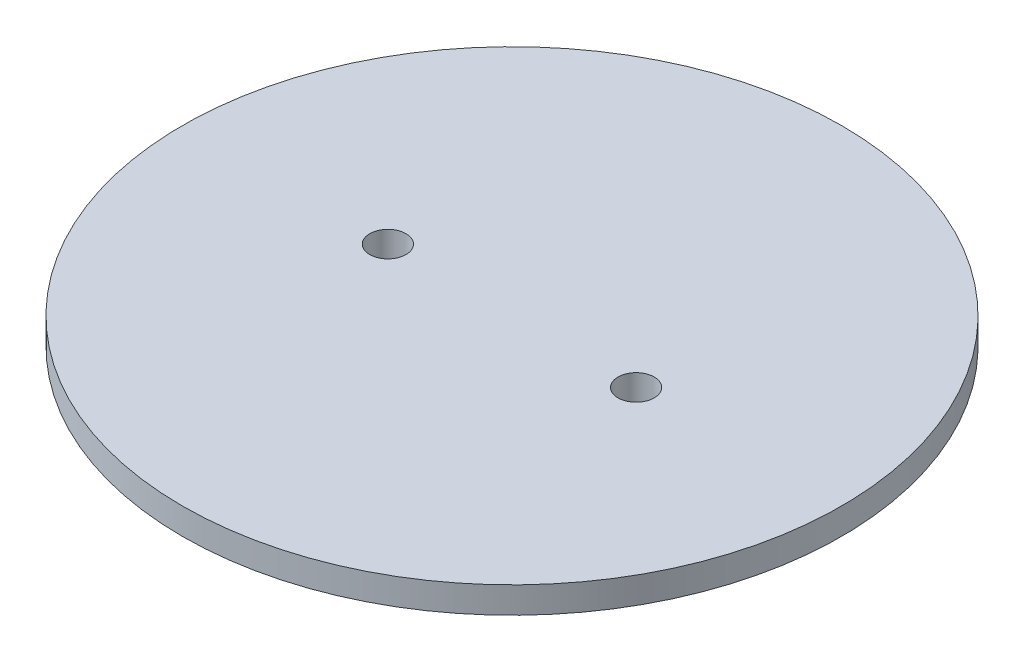
ISO-10303-21;
HEADER;
FILE_DESCRIPTION(('STEP AP214'),'2;1');
FILE_NAME('part.step','',(''),(''),'','','');
FILE_SCHEMA(('AUTOMOTIVE_DESIGN { 1 0 10303 214 1 1 1 1 }'));
ENDSEC;
DATA;
#1=APPLICATION_CONTEXT('core data for automotive mechanical design processes');
#2=APPLICATION_PROTOCOL_DEFINITION('international standard','automotive_design',2000,#1);
#3=PRODUCT_CONTEXT('',#1,'mechanical');
#4=PRODUCT('Part','Part','',(#3));
#5=PRODUCT_RELATED_PRODUCT_CATEGORY('part','',(#4));
#6=PRODUCT_DEFINITION_FORMATION('','',#4);
#7=PRODUCT_DEFINITION_CONTEXT('part definition',#1,'design');
#8=PRODUCT_DEFINITION('design','',#6,#7);
#9=PRODUCT_DEFINITION_SHAPE('','',#8);
#10=(LENGTH_UNIT() NAMED_UNIT(*) SI_UNIT(.MILLI.,.METRE.));
#11=(NAMED_UNIT(*) PLANE_ANGLE_UNIT() SI_UNIT($,.RADIAN.));
#12=(NAMED_UNIT(*) SI_UNIT($,.STERADIAN.) SOLID_ANGLE_UNIT());
#13=UNCERTAINTY_MEASURE_WITH_UNIT(LENGTH_MEASURE(1.E-05),#10,'distance_accuracy_value','');
#14=(GEOMETRIC_REPRESENTATION_CONTEXT(3) GLOBAL_UNCERTAINTY_ASSIGNED_CONTEXT((#13)) GLOBAL_UNIT_ASSIGNED_CONTEXT((#10,
#11,#12)) REPRESENTATION_CONTEXT('',''));
#15=CARTESIAN_POINT('',(0.,0.,0.));
#16=DIRECTION('',(0.,0.,1.));
#17=DIRECTION('',(1.,0.,0.));
#18=AXIS2_PLACEMENT_3D('',#15,#16,#17);
#19=CARTESIAN_POINT('',(-18.83,4.,0.));
#20=DIRECTION('',(0.,-1.,0.));
#21=DIRECTION('',(0.,0.,-1.));
#22=AXIS2_PLACEMENT_3D('',#19,#20,#21);
#23=CYLINDRICAL_SURFACE('',#22,2.75);
#24=CARTESIAN_POINT('',(-18.83,4.,0.));
#25=DIRECTION('',(0.,1.,0.));
#26=DIRECTION('',(0.,0.,1.));
#27=AXIS2_PLACEMENT_3D('',#24,#25,#26);
#28=CIRCLE('',#27,2.75);
#29=CARTESIAN_POINT('',(-18.83,4.,2.75));
#30=VERTEX_POINT('',#29);
#31=EDGE_CURVE('E41',#30,#30,#28,.T.);
#32=ORIENTED_EDGE('',*,*,#31,.T.);
#33=EDGE_LOOP('',(#32));
#34=FACE_BOUND('',#33,.T.);
#35=CARTESIAN_POINT('',(-18.83,0.,0.));
#36=DIRECTION('',(0.,1.,0.));
#37=DIRECTION('',(0.,0.,1.));
#38=AXIS2_PLACEMENT_3D('',#35,#36,#37);
#39=CIRCLE('',#38,2.75);
#40=CARTESIAN_POINT('',(-18.83,0.,2.75));
#41=VERTEX_POINT('',#40);
#42=EDGE_CURVE('E52',#41,#41,#39,.T.);
#43=ORIENTED_EDGE('',*,*,#42,.F.);
#44=EDGE_LOOP('',(#43));
#45=FACE_BOUND('',#44,.T.);
#46=ADVANCED_FACE('F33',(#34,#45),#23,.F.);
#47=CARTESIAN_POINT('',(18.83,4.,0.));
#48=DIRECTION('',(0.,-1.,0.));
#49=DIRECTION('',(0.,0.,-1.));
#50=AXIS2_PLACEMENT_3D('',#47,#48,#49);
#51=CYLINDRICAL_SURFACE('',#50,2.75);
#52=CARTESIAN_POINT('',(18.83,4.,0.));
#53=DIRECTION('',(0.,1.,0.));
#54=DIRECTION('',(0.,0.,1.));
#55=AXIS2_PLACEMENT_3D('',#52,#53,#54);
#56=CIRCLE('',#55,2.75);
#57=CARTESIAN_POINT('',(18.83,4.,2.75));
#58=VERTEX_POINT('',#57);
#59=EDGE_CURVE('E46',#58,#58,#56,.T.);
#60=ORIENTED_EDGE('',*,*,#59,.T.);
#61=EDGE_LOOP('',(#60));
#62=FACE_BOUND('',#61,.T.);
#63=CARTESIAN_POINT('',(18.83,0.,0.));
#64=DIRECTION('',(0.,1.,0.));
#65=DIRECTION('',(0.,0.,1.));
#66=AXIS2_PLACEMENT_3D('',#63,#64,#65);
#67=CIRCLE('',#66,2.75);
#68=CARTESIAN_POINT('',(18.83,0.,2.75));
#69=VERTEX_POINT('',#68);
#70=EDGE_CURVE('E50',#69,#69,#67,.T.);
#71=ORIENTED_EDGE('',*,*,#70,.F.);
#72=EDGE_LOOP('',(#71));
#73=FACE_BOUND('',#72,.T.);
#74=ADVANCED_FACE('F35',(#62,#73),#51,.F.);
#75=CARTESIAN_POINT('',(0.,4.,0.));
#76=DIRECTION('',(0.,-1.,0.));
#77=DIRECTION('',(0.,0.,-1.));
#78=AXIS2_PLACEMENT_3D('',#75,#76,#77);
#79=CYLINDRICAL_SURFACE('',#78,50.);
#80=CARTESIAN_POINT('',(0.,4.,0.));
#81=DIRECTION('',(0.,1.,0.));
#82=DIRECTION('',(0.,0.,1.));
#83=AXIS2_PLACEMENT_3D('',#80,#81,#82);
#84=CIRCLE('',#83,50.);
#85=CARTESIAN_POINT('',(0.,4.,50.));
#86=VERTEX_POINT('',#85);
#87=EDGE_CURVE('E10',#86,#86,#84,.T.);
#88=ORIENTED_EDGE('',*,*,#87,.F.);
#89=EDGE_LOOP('',(#88));
#90=FACE_BOUND('',#89,.T.);
#91=CARTESIAN_POINT('',(0.,0.,0.));
#92=DIRECTION('',(0.,1.,0.));
#93=DIRECTION('',(0.,0.,1.));
#94=AXIS2_PLACEMENT_3D('',#91,#92,#93);
#95=CIRCLE('',#94,50.);
#96=CARTESIAN_POINT('',(0.,0.,50.));
#97=VERTEX_POINT('',#96);
#98=EDGE_CURVE('E37',#97,#97,#95,.T.);
#99=ORIENTED_EDGE('',*,*,#98,.T.);
#100=EDGE_LOOP('',(#99));
#101=FACE_BOUND('',#100,.T.);
#102=ADVANCED_FACE('F68',(#90,#101),#79,.T.);
#103=CARTESIAN_POINT('',(0.,4.,0.));
#104=DIRECTION('',(0.,1.,0.));
#105=DIRECTION('',(0.,0.,1.));
#106=AXIS2_PLACEMENT_3D('',#103,#104,#105);
#107=PLANE('',#106);
#108=ORIENTED_EDGE('',*,*,#59,.F.);
#109=EDGE_LOOP('',(#108));
#110=FACE_BOUND('',#109,.T.);
#111=ORIENTED_EDGE('',*,*,#31,.F.);
#112=EDGE_LOOP('',(#111));
#113=FACE_BOUND('',#112,.T.);
#114=ORIENTED_EDGE('',*,*,#87,.T.);
#115=EDGE_LOOP('',(#114));
#116=FACE_BOUND('',#115,.T.);
#117=ADVANCED_FACE('F64',(#110,#113,#116),#107,.T.);
#118=CARTESIAN_POINT('',(0.,0.,0.));
#119=DIRECTION('',(0.,1.,0.));
#120=DIRECTION('',(0.,0.,1.));
#121=AXIS2_PLACEMENT_3D('',#118,#119,#120);
#122=PLANE('',#121);
#123=ORIENTED_EDGE('',*,*,#70,.T.);
#124=EDGE_LOOP('',(#123));
#125=FACE_BOUND('',#124,.T.);
#126=ORIENTED_EDGE('',*,*,#42,.T.);
#127=EDGE_LOOP('',(#126));
#128=FACE_BOUND('',#127,.T.);
#129=ORIENTED_EDGE('',*,*,#98,.F.);
#130=EDGE_LOOP('',(#129));
#131=FACE_BOUND('',#130,.T.);
#132=ADVANCED_FACE('F67',(#125,#128,#131),#122,.F.);
#133=CLOSED_SHELL('',(#46,#74,#102,#117,#132));
#134=MANIFOLD_SOLID_BREP('B2',#133);
#135=ADVANCED_BREP_SHAPE_REPRESENTATION('',(#18,#134),#14);
#136=SHAPE_DEFINITION_REPRESENTATION(#9,#135);
ENDSEC;
END-ISO-10303-21;
